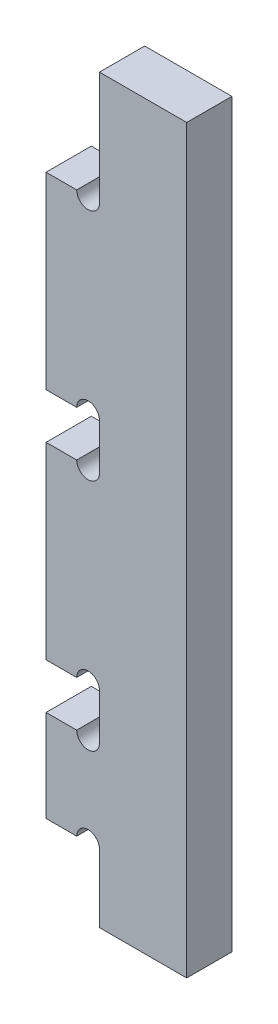
ISO-10303-21;
HEADER;
FILE_DESCRIPTION(('STEP AP214'),'2;1');
FILE_NAME('part.step','',(''),(''),'','','');
FILE_SCHEMA(('AUTOMOTIVE_DESIGN { 1 0 10303 214 1 1 1 1 }'));
ENDSEC;
DATA;
#1=APPLICATION_CONTEXT('core data for automotive mechanical design processes');
#2=APPLICATION_PROTOCOL_DEFINITION('international standard','automotive_design',2000,#1);
#3=PRODUCT_CONTEXT('',#1,'mechanical');
#4=PRODUCT('Part','Part','',(#3));
#5=PRODUCT_RELATED_PRODUCT_CATEGORY('part','',(#4));
#6=PRODUCT_DEFINITION_FORMATION('','',#4);
#7=PRODUCT_DEFINITION_CONTEXT('part definition',#1,'design');
#8=PRODUCT_DEFINITION('design','',#6,#7);
#9=PRODUCT_DEFINITION_SHAPE('','',#8);
#10=(LENGTH_UNIT() NAMED_UNIT(*) SI_UNIT(.MILLI.,.METRE.));
#11=(NAMED_UNIT(*) PLANE_ANGLE_UNIT() SI_UNIT($,.RADIAN.));
#12=(NAMED_UNIT(*) SI_UNIT($,.STERADIAN.) SOLID_ANGLE_UNIT());
#13=UNCERTAINTY_MEASURE_WITH_UNIT(LENGTH_MEASURE(1.E-05),#10,'distance_accuracy_value','');
#14=(GEOMETRIC_REPRESENTATION_CONTEXT(3) GLOBAL_UNCERTAINTY_ASSIGNED_CONTEXT((#13)) GLOBAL_UNIT_ASSIGNED_CONTEXT((#10,
#11,#12)) REPRESENTATION_CONTEXT('',''));
#15=CARTESIAN_POINT('',(0.,0.,0.));
#16=DIRECTION('',(0.,0.,1.));
#17=DIRECTION('',(1.,0.,0.));
#18=AXIS2_PLACEMENT_3D('',#15,#16,#17);
#19=CARTESIAN_POINT('',(210.5,170.,12.7));
#20=DIRECTION('',(1.,0.,0.));
#21=DIRECTION('',(0.,1.,0.));
#22=AXIS2_PLACEMENT_3D('',#19,#20,#21);
#23=PLANE('',#22);
#24=DIRECTION('',(0.,-1.,0.));
#25=VECTOR('',#24,1.);
#26=CARTESIAN_POINT('',(210.5,170.,12.7));
#27=LINE('',#26,#25);
#28=CARTESIAN_POINT('',(210.5,25.8000000000001,12.7));
#29=VERTEX_POINT('',#28);
#30=CARTESIAN_POINT('',(210.5,0.,12.7));
#31=VERTEX_POINT('',#30);
#32=EDGE_CURVE('E311',#29,#31,#27,.T.);
#33=ORIENTED_EDGE('',*,*,#32,.F.);
#34=DIRECTION('',(0.,0.,1.));
#35=VECTOR('',#34,1.);
#36=CARTESIAN_POINT('',(210.5,25.8000000000001,0.));
#37=LINE('',#36,#35);
#38=CARTESIAN_POINT('',(210.5,25.8000000000001,0.));
#39=VERTEX_POINT('',#38);
#40=EDGE_CURVE('E225',#39,#29,#37,.T.);
#41=ORIENTED_EDGE('',*,*,#40,.F.);
#42=DIRECTION('',(0.,-1.,0.));
#43=VECTOR('',#42,1.);
#44=CARTESIAN_POINT('',(210.5,170.,0.));
#45=LINE('',#44,#43);
#46=CARTESIAN_POINT('',(210.5,0.,0.));
#47=VERTEX_POINT('',#46);
#48=EDGE_CURVE('E205',#39,#47,#45,.T.);
#49=ORIENTED_EDGE('',*,*,#48,.T.);
#50=DIRECTION('',(0.,0.,-1.));
#51=VECTOR('',#50,1.);
#52=CARTESIAN_POINT('',(210.5,0.,12.7));
#53=LINE('',#52,#51);
#54=EDGE_CURVE('E315',#31,#47,#53,.T.);
#55=ORIENTED_EDGE('',*,*,#54,.F.);
#56=EDGE_LOOP('',(#33,#41,#49,#55));
#57=FACE_BOUND('',#56,.T.);
#58=ADVANCED_FACE('F35',(#57),#23,.F.);
#59=CARTESIAN_POINT('',(210.5,91.5000000000001,0.));
#60=VERTEX_POINT('',#59);
#61=CARTESIAN_POINT('',(210.5,38.6000000000001,0.));
#62=VERTEX_POINT('',#61);
#63=EDGE_CURVE('E334',#60,#62,#45,.T.);
#64=ORIENTED_EDGE('',*,*,#63,.T.);
#65=DIRECTION('',(0.,0.,1.));
#66=VECTOR('',#65,1.);
#67=CARTESIAN_POINT('',(210.5,38.6000000000001,0.));
#68=LINE('',#67,#66);
#69=CARTESIAN_POINT('',(210.5,38.6000000000001,12.7));
#70=VERTEX_POINT('',#69);
#71=EDGE_CURVE('E228',#62,#70,#68,.T.);
#72=ORIENTED_EDGE('',*,*,#71,.T.);
#73=CARTESIAN_POINT('',(210.5,91.5000000000001,12.7));
#74=VERTEX_POINT('',#73);
#75=EDGE_CURVE('E316',#74,#70,#27,.T.);
#76=ORIENTED_EDGE('',*,*,#75,.F.);
#77=DIRECTION('',(0.,0.,1.));
#78=VECTOR('',#77,1.);
#79=CARTESIAN_POINT('',(210.5,91.5000000000001,0.));
#80=LINE('',#79,#78);
#81=EDGE_CURVE('E263',#60,#74,#80,.T.);
#82=ORIENTED_EDGE('',*,*,#81,.F.);
#83=EDGE_LOOP('',(#64,#72,#76,#82));
#84=FACE_BOUND('',#83,.T.);
#85=ADVANCED_FACE('F381',(#84),#23,.F.);
#86=CARTESIAN_POINT('',(219.1,0.,12.7));
#87=DIRECTION('',(0.,1.,0.));
#88=DIRECTION('',(0.,0.,1.));
#89=AXIS2_PLACEMENT_3D('',#86,#87,#88);
#90=PLANE('',#89);
#91=DIRECTION('',(1.,0.,0.));
#92=VECTOR('',#91,1.);
#93=CARTESIAN_POINT('',(219.1,0.,0.));
#94=LINE('',#93,#92);
#95=CARTESIAN_POINT('',(219.1,0.,0.));
#96=VERTEX_POINT('',#95);
#97=EDGE_CURVE('E290',#47,#96,#94,.T.);
#98=ORIENTED_EDGE('',*,*,#97,.T.);
#99=DIRECTION('',(0.,0.,-1.));
#100=VECTOR('',#99,1.);
#101=CARTESIAN_POINT('',(219.1,0.,12.7));
#102=LINE('',#101,#100);
#103=CARTESIAN_POINT('',(219.1,0.,12.7));
#104=VERTEX_POINT('',#103);
#105=EDGE_CURVE('E11',#104,#96,#102,.T.);
#106=ORIENTED_EDGE('',*,*,#105,.F.);
#107=DIRECTION('',(1.,0.,0.));
#108=VECTOR('',#107,1.);
#109=CARTESIAN_POINT('',(219.1,0.,12.7));
#110=LINE('',#109,#108);
#111=EDGE_CURVE('E295',#31,#104,#110,.T.);
#112=ORIENTED_EDGE('',*,*,#111,.F.);
#113=ORIENTED_EDGE('',*,*,#54,.T.);
#114=EDGE_LOOP('',(#98,#106,#112,#113));
#115=FACE_BOUND('',#114,.T.);
#116=ADVANCED_FACE('F37',(#115),#90,.F.);
#117=CARTESIAN_POINT('',(222.3,0.,12.7));
#118=DIRECTION('',(0.,0.,-1.));
#119=DIRECTION('',(-1.,0.,0.));
#120=AXIS2_PLACEMENT_3D('',#117,#118,#119);
#121=CYLINDRICAL_SURFACE('',#120,3.20000000000001);
#122=CARTESIAN_POINT('',(222.3,0.,0.));
#123=DIRECTION('',(0.,0.,-1.));
#124=DIRECTION('',(1.,0.,0.));
#125=AXIS2_PLACEMENT_3D('',#122,#123,#124);
#126=CIRCLE('',#125,3.20000000000001);
#127=CARTESIAN_POINT('',(225.5,0.,0.));
#128=VERTEX_POINT('',#127);
#129=EDGE_CURVE('E319',#96,#128,#126,.T.);
#130=ORIENTED_EDGE('',*,*,#129,.T.);
#131=DIRECTION('',(0.,0.,-1.));
#132=VECTOR('',#131,1.);
#133=CARTESIAN_POINT('',(225.5,0.,12.7));
#134=LINE('',#133,#132);
#135=CARTESIAN_POINT('',(225.5,0.,12.7));
#136=VERTEX_POINT('',#135);
#137=EDGE_CURVE('E43',#136,#128,#134,.T.);
#138=ORIENTED_EDGE('',*,*,#137,.F.);
#139=CARTESIAN_POINT('',(222.3,0.,12.7));
#140=DIRECTION('',(0.,0.,-1.));
#141=DIRECTION('',(1.,0.,0.));
#142=AXIS2_PLACEMENT_3D('',#139,#140,#141);
#143=CIRCLE('',#142,3.20000000000001);
#144=EDGE_CURVE('E298',#104,#136,#143,.T.);
#145=ORIENTED_EDGE('',*,*,#144,.F.);
#146=ORIENTED_EDGE('',*,*,#105,.T.);
#147=EDGE_LOOP('',(#130,#138,#145,#146));
#148=FACE_BOUND('',#147,.T.);
#149=ADVANCED_FACE('F372',(#148),#121,.F.);
#150=CARTESIAN_POINT('',(225.5,0.,12.7));
#151=DIRECTION('',(1.,0.,0.));
#152=DIRECTION('',(0.,0.,-1.));
#153=AXIS2_PLACEMENT_3D('',#150,#151,#152);
#154=PLANE('',#153);
#155=DIRECTION('',(0.,-1.,0.));
#156=VECTOR('',#155,1.);
#157=CARTESIAN_POINT('',(225.5,0.,0.));
#158=LINE('',#157,#156);
#159=CARTESIAN_POINT('',(225.5,-19.05,0.));
#160=VERTEX_POINT('',#159);
#161=EDGE_CURVE('E321',#128,#160,#158,.T.);
#162=ORIENTED_EDGE('',*,*,#161,.T.);
#163=DIRECTION('',(0.,0.,-1.));
#164=VECTOR('',#163,1.);
#165=CARTESIAN_POINT('',(225.5,-19.05,12.7));
#166=LINE('',#165,#164);
#167=CARTESIAN_POINT('',(225.5,-19.05,12.7));
#168=VERTEX_POINT('',#167);
#169=EDGE_CURVE('E346',#168,#160,#166,.T.);
#170=ORIENTED_EDGE('',*,*,#169,.F.);
#171=DIRECTION('',(0.,-1.,0.));
#172=VECTOR('',#171,1.);
#173=CARTESIAN_POINT('',(225.5,0.,12.7));
#174=LINE('',#173,#172);
#175=EDGE_CURVE('E301',#136,#168,#174,.T.);
#176=ORIENTED_EDGE('',*,*,#175,.F.);
#177=ORIENTED_EDGE('',*,*,#137,.T.);
#178=EDGE_LOOP('',(#162,#170,#176,#177));
#179=FACE_BOUND('',#178,.T.);
#180=ADVANCED_FACE('F353',(#179),#154,.F.);
#181=CARTESIAN_POINT('',(225.5,-19.05,12.7));
#182=DIRECTION('',(0.,1.,0.));
#183=DIRECTION('',(0.,0.,1.));
#184=AXIS2_PLACEMENT_3D('',#181,#182,#183);
#185=PLANE('',#184);
#186=DIRECTION('',(1.,0.,0.));
#187=VECTOR('',#186,1.);
#188=CARTESIAN_POINT('',(225.5,-19.05,0.));
#189=LINE('',#188,#187);
#190=CARTESIAN_POINT('',(250.,-19.05,0.));
#191=VERTEX_POINT('',#190);
#192=EDGE_CURVE('E323',#160,#191,#189,.T.);
#193=ORIENTED_EDGE('',*,*,#192,.T.);
#194=DIRECTION('',(0.,0.,-1.));
#195=VECTOR('',#194,1.);
#196=CARTESIAN_POINT('',(250.,-19.05,12.7));
#197=LINE('',#196,#195);
#198=CARTESIAN_POINT('',(250.,-19.05,12.7));
#199=VERTEX_POINT('',#198);
#200=EDGE_CURVE('E343',#199,#191,#197,.T.);
#201=ORIENTED_EDGE('',*,*,#200,.F.);
#202=DIRECTION('',(1.,0.,0.));
#203=VECTOR('',#202,1.);
#204=CARTESIAN_POINT('',(225.5,-19.05,12.7));
#205=LINE('',#204,#203);
#206=EDGE_CURVE('E303',#168,#199,#205,.T.);
#207=ORIENTED_EDGE('',*,*,#206,.F.);
#208=ORIENTED_EDGE('',*,*,#169,.T.);
#209=EDGE_LOOP('',(#193,#201,#207,#208));
#210=FACE_BOUND('',#209,.T.);
#211=ADVANCED_FACE('F360',(#210),#185,.F.);
#212=CARTESIAN_POINT('',(250.,189.05,12.7));
#213=DIRECTION('',(-1.,0.,0.));
#214=DIRECTION('',(0.,0.,1.));
#215=AXIS2_PLACEMENT_3D('',#212,#213,#214);
#216=PLANE('',#215);
#217=DIRECTION('',(0.,1.,0.));
#218=VECTOR('',#217,1.);
#219=CARTESIAN_POINT('',(250.,189.05,0.));
#220=LINE('',#219,#218);
#221=CARTESIAN_POINT('',(250.,189.05,0.));
#222=VERTEX_POINT('',#221);
#223=EDGE_CURVE('E326',#191,#222,#220,.T.);
#224=ORIENTED_EDGE('',*,*,#223,.T.);
#225=DIRECTION('',(0.,0.,-1.));
#226=VECTOR('',#225,1.);
#227=CARTESIAN_POINT('',(250.,189.05,12.7));
#228=LINE('',#227,#226);
#229=CARTESIAN_POINT('',(250.,189.05,12.7));
#230=VERTEX_POINT('',#229);
#231=EDGE_CURVE('E340',#230,#222,#228,.T.);
#232=ORIENTED_EDGE('',*,*,#231,.F.);
#233=DIRECTION('',(0.,1.,0.));
#234=VECTOR('',#233,1.);
#235=CARTESIAN_POINT('',(250.,-19.05,12.7));
#236=LINE('',#235,#234);
#237=EDGE_CURVE('E305',#199,#230,#236,.T.);
#238=ORIENTED_EDGE('',*,*,#237,.F.);
#239=ORIENTED_EDGE('',*,*,#200,.T.);
#240=EDGE_LOOP('',(#224,#232,#238,#239));
#241=FACE_BOUND('',#240,.T.);
#242=ADVANCED_FACE('F364',(#241),#216,.F.);
#243=CARTESIAN_POINT('',(225.5,189.05,12.7));
#244=DIRECTION('',(0.,-1.,0.));
#245=DIRECTION('',(0.,0.,-1.));
#246=AXIS2_PLACEMENT_3D('',#243,#244,#245);
#247=PLANE('',#246);
#248=DIRECTION('',(-1.,0.,0.));
#249=VECTOR('',#248,1.);
#250=CARTESIAN_POINT('',(225.5,189.05,0.));
#251=LINE('',#250,#249);
#252=CARTESIAN_POINT('',(225.5,189.05,0.));
#253=VERTEX_POINT('',#252);
#254=EDGE_CURVE('E328',#222,#253,#251,.T.);
#255=ORIENTED_EDGE('',*,*,#254,.T.);
#256=DIRECTION('',(0.,0.,-1.));
#257=VECTOR('',#256,1.);
#258=CARTESIAN_POINT('',(225.5,189.05,12.7));
#259=LINE('',#258,#257);
#260=CARTESIAN_POINT('',(225.5,189.05,12.7));
#261=VERTEX_POINT('',#260);
#262=EDGE_CURVE('E337',#261,#253,#259,.T.);
#263=ORIENTED_EDGE('',*,*,#262,.F.);
#264=DIRECTION('',(-1.,0.,0.));
#265=VECTOR('',#264,1.);
#266=CARTESIAN_POINT('',(225.5,189.05,12.7));
#267=LINE('',#266,#265);
#268=EDGE_CURVE('E307',#230,#261,#267,.T.);
#269=ORIENTED_EDGE('',*,*,#268,.F.);
#270=ORIENTED_EDGE('',*,*,#231,.T.);
#271=EDGE_LOOP('',(#255,#263,#269,#270));
#272=FACE_BOUND('',#271,.T.);
#273=ADVANCED_FACE('F420',(#272),#247,.F.);
#274=CARTESIAN_POINT('',(225.5,170.,12.7));
#275=DIRECTION('',(1.,0.,0.));
#276=DIRECTION('',(0.,1.,0.));
#277=AXIS2_PLACEMENT_3D('',#274,#275,#276);
#278=PLANE('',#277);
#279=DIRECTION('',(0.,-1.,0.));
#280=VECTOR('',#279,1.);
#281=CARTESIAN_POINT('',(225.5,170.,0.));
#282=LINE('',#281,#280);
#283=CARTESIAN_POINT('',(225.5,157.2,0.));
#284=VERTEX_POINT('',#283);
#285=EDGE_CURVE('E330',#253,#284,#282,.T.);
#286=ORIENTED_EDGE('',*,*,#285,.T.);
#287=DIRECTION('',(0.,0.,1.));
#288=VECTOR('',#287,1.);
#289=CARTESIAN_POINT('',(225.5,157.2,0.));
#290=LINE('',#289,#288);
#291=CARTESIAN_POINT('',(225.5,157.2,12.7));
#292=VERTEX_POINT('',#291);
#293=EDGE_CURVE('E291',#284,#292,#290,.T.);
#294=ORIENTED_EDGE('',*,*,#293,.T.);
#295=DIRECTION('',(0.,-1.,0.));
#296=VECTOR('',#295,1.);
#297=CARTESIAN_POINT('',(225.5,170.,12.7));
#298=LINE('',#297,#296);
#299=EDGE_CURVE('E309',#261,#292,#298,.T.);
#300=ORIENTED_EDGE('',*,*,#299,.F.);
#301=ORIENTED_EDGE('',*,*,#262,.T.);
#302=EDGE_LOOP('',(#286,#294,#300,#301));
#303=FACE_BOUND('',#302,.T.);
#304=ADVANCED_FACE('F413',(#303),#278,.F.);
#305=CARTESIAN_POINT('',(210.5,157.2,0.));
#306=VERTEX_POINT('',#305);
#307=CARTESIAN_POINT('',(210.5,104.3,0.));
#308=VERTEX_POINT('',#307);
#309=EDGE_CURVE('E299',#306,#308,#45,.T.);
#310=ORIENTED_EDGE('',*,*,#309,.T.);
#311=DIRECTION('',(0.,0.,1.));
#312=VECTOR('',#311,1.);
#313=CARTESIAN_POINT('',(210.5,104.3,0.));
#314=LINE('',#313,#312);
#315=CARTESIAN_POINT('',(210.5,104.3,12.7));
#316=VERTEX_POINT('',#315);
#317=EDGE_CURVE('E266',#308,#316,#314,.T.);
#318=ORIENTED_EDGE('',*,*,#317,.T.);
#319=CARTESIAN_POINT('',(210.5,157.2,12.7));
#320=VERTEX_POINT('',#319);
#321=EDGE_CURVE('E312',#320,#316,#27,.T.);
#322=ORIENTED_EDGE('',*,*,#321,.F.);
#323=DIRECTION('',(0.,0.,1.));
#324=VECTOR('',#323,1.);
#325=CARTESIAN_POINT('',(210.5,157.2,0.));
#326=LINE('',#325,#324);
#327=EDGE_CURVE('E288',#306,#320,#326,.T.);
#328=ORIENTED_EDGE('',*,*,#327,.F.);
#329=EDGE_LOOP('',(#310,#318,#322,#328));
#330=FACE_BOUND('',#329,.T.);
#331=ADVANCED_FACE('F406',(#330),#23,.F.);
#332=CARTESIAN_POINT('',(222.3,170.,12.7));
#333=DIRECTION('',(0.,0.,1.));
#334=DIRECTION('',(1.,0.,0.));
#335=AXIS2_PLACEMENT_3D('',#332,#333,#334);
#336=PLANE('',#335);
#337=DIRECTION('',(1.,0.,0.));
#338=VECTOR('',#337,1.);
#339=CARTESIAN_POINT('',(210.5,25.8000000000001,12.7));
#340=LINE('',#339,#338);
#341=CARTESIAN_POINT('',(219.1,25.8000000000001,12.7));
#342=VERTEX_POINT('',#341);
#343=EDGE_CURVE('E190',#29,#342,#340,.T.);
#344=ORIENTED_EDGE('',*,*,#343,.F.);
#345=ORIENTED_EDGE('',*,*,#32,.T.);
#346=ORIENTED_EDGE('',*,*,#111,.T.);
#347=ORIENTED_EDGE('',*,*,#144,.T.);
#348=ORIENTED_EDGE('',*,*,#175,.T.);
#349=ORIENTED_EDGE('',*,*,#206,.T.);
#350=ORIENTED_EDGE('',*,*,#237,.T.);
#351=ORIENTED_EDGE('',*,*,#268,.T.);
#352=ORIENTED_EDGE('',*,*,#299,.T.);
#353=CARTESIAN_POINT('',(222.3,157.2,12.7));
#354=DIRECTION('',(0.,0.,1.));
#355=DIRECTION('',(1.,0.,0.));
#356=AXIS2_PLACEMENT_3D('',#353,#354,#355);
#357=CIRCLE('',#356,3.20000000000001);
#358=CARTESIAN_POINT('',(219.1,157.2,12.7));
#359=VERTEX_POINT('',#358);
#360=EDGE_CURVE('E280',#359,#292,#357,.T.);
#361=ORIENTED_EDGE('',*,*,#360,.F.);
#362=DIRECTION('',(1.,0.,0.));
#363=VECTOR('',#362,1.);
#364=CARTESIAN_POINT('',(210.5,157.2,12.7));
#365=LINE('',#364,#363);
#366=EDGE_CURVE('E265',#320,#359,#365,.T.);
#367=ORIENTED_EDGE('',*,*,#366,.F.);
#368=ORIENTED_EDGE('',*,*,#321,.T.);
#369=DIRECTION('',(-1.,0.,0.));
#370=VECTOR('',#369,1.);
#371=CARTESIAN_POINT('',(210.5,104.3,12.7));
#372=LINE('',#371,#370);
#373=CARTESIAN_POINT('',(219.1,104.3,12.7));
#374=VERTEX_POINT('',#373);
#375=EDGE_CURVE('E240',#374,#316,#372,.T.);
#376=ORIENTED_EDGE('',*,*,#375,.F.);
#377=CARTESIAN_POINT('',(222.3,104.3,12.7));
#378=DIRECTION('',(0.,0.,1.));
#379=DIRECTION('',(1.,0.,0.));
#380=AXIS2_PLACEMENT_3D('',#377,#378,#379);
#381=CIRCLE('',#380,3.20000000000001);
#382=CARTESIAN_POINT('',(225.5,104.3,12.7));
#383=VERTEX_POINT('',#382);
#384=EDGE_CURVE('E259',#383,#374,#381,.T.);
#385=ORIENTED_EDGE('',*,*,#384,.F.);
#386=DIRECTION('',(0.,1.,0.));
#387=VECTOR('',#386,1.);
#388=CARTESIAN_POINT('',(225.5,91.5000000000001,12.7));
#389=LINE('',#388,#387);
#390=CARTESIAN_POINT('',(225.5,91.5000000000001,12.7));
#391=VERTEX_POINT('',#390);
#392=EDGE_CURVE('E256',#391,#383,#389,.T.);
#393=ORIENTED_EDGE('',*,*,#392,.F.);
#394=CARTESIAN_POINT('',(222.3,91.5000000000001,12.7));
#395=DIRECTION('',(0.,0.,1.));
#396=DIRECTION('',(1.,0.,0.));
#397=AXIS2_PLACEMENT_3D('',#394,#395,#396);
#398=CIRCLE('',#397,3.20000000000001);
#399=CARTESIAN_POINT('',(219.1,91.5000000000001,12.7));
#400=VERTEX_POINT('',#399);
#401=EDGE_CURVE('E253',#400,#391,#398,.T.);
#402=ORIENTED_EDGE('',*,*,#401,.F.);
#403=DIRECTION('',(1.,0.,0.));
#404=VECTOR('',#403,1.);
#405=CARTESIAN_POINT('',(210.5,91.5000000000001,12.7));
#406=LINE('',#405,#404);
#407=EDGE_CURVE('E227',#74,#400,#406,.T.);
#408=ORIENTED_EDGE('',*,*,#407,.F.);
#409=ORIENTED_EDGE('',*,*,#75,.T.);
#410=DIRECTION('',(-1.,0.,0.));
#411=VECTOR('',#410,1.);
#412=CARTESIAN_POINT('',(210.5,38.6000000000001,12.7));
#413=LINE('',#412,#411);
#414=CARTESIAN_POINT('',(219.1,38.6,12.7));
#415=VERTEX_POINT('',#414);
#416=EDGE_CURVE('E206',#415,#70,#413,.T.);
#417=ORIENTED_EDGE('',*,*,#416,.F.);
#418=CARTESIAN_POINT('',(222.3,38.6,12.7));
#419=DIRECTION('',(0.,0.,1.));
#420=DIRECTION('',(1.,0.,0.));
#421=AXIS2_PLACEMENT_3D('',#418,#419,#420);
#422=CIRCLE('',#421,3.20000000000001);
#423=CARTESIAN_POINT('',(225.5,38.6000000000001,12.7));
#424=VERTEX_POINT('',#423);
#425=EDGE_CURVE('E208',#424,#415,#422,.T.);
#426=ORIENTED_EDGE('',*,*,#425,.F.);
#427=DIRECTION('',(0.,1.,0.));
#428=VECTOR('',#427,1.);
#429=CARTESIAN_POINT('',(225.5,25.8000000000001,12.7));
#430=LINE('',#429,#428);
#431=CARTESIAN_POINT('',(225.5,25.8000000000001,12.7));
#432=VERTEX_POINT('',#431);
#433=EDGE_CURVE('E220',#432,#424,#430,.T.);
#434=ORIENTED_EDGE('',*,*,#433,.F.);
#435=CARTESIAN_POINT('',(222.3,25.8000000000001,12.7));
#436=DIRECTION('',(0.,0.,1.));
#437=DIRECTION('',(1.,0.,0.));
#438=AXIS2_PLACEMENT_3D('',#435,#436,#437);
#439=CIRCLE('',#438,3.20000000000001);
#440=EDGE_CURVE('E218',#342,#432,#439,.T.);
#441=ORIENTED_EDGE('',*,*,#440,.F.);
#442=EDGE_LOOP('',(#344,#345,#346,#347,#348,#349,#350,#351,#352,#361,#367,#368,#376,#385,#393,
#402,#408,#409,#417,#426,#434,#441));
#443=FACE_BOUND('',#442,.T.);
#444=ADVANCED_FACE('F368',(#443),#336,.T.);
#445=CARTESIAN_POINT('',(222.3,170.,0.));
#446=DIRECTION('',(0.,0.,1.));
#447=DIRECTION('',(1.,0.,0.));
#448=AXIS2_PLACEMENT_3D('',#445,#446,#447);
#449=PLANE('',#448);
#450=ORIENTED_EDGE('',*,*,#48,.F.);
#451=DIRECTION('',(1.,0.,0.));
#452=VECTOR('',#451,1.);
#453=CARTESIAN_POINT('',(210.5,25.8000000000001,0.));
#454=LINE('',#453,#452);
#455=CARTESIAN_POINT('',(219.1,25.8000000000001,0.));
#456=VERTEX_POINT('',#455);
#457=EDGE_CURVE('E187',#39,#456,#454,.T.);
#458=ORIENTED_EDGE('',*,*,#457,.T.);
#459=CARTESIAN_POINT('',(222.3,25.8000000000001,0.));
#460=DIRECTION('',(0.,0.,1.));
#461=DIRECTION('',(1.,0.,0.));
#462=AXIS2_PLACEMENT_3D('',#459,#460,#461);
#463=CIRCLE('',#462,3.20000000000001);
#464=CARTESIAN_POINT('',(225.5,25.8000000000001,0.));
#465=VERTEX_POINT('',#464);
#466=EDGE_CURVE('E198',#456,#465,#463,.T.);
#467=ORIENTED_EDGE('',*,*,#466,.T.);
#468=DIRECTION('',(0.,1.,0.));
#469=VECTOR('',#468,1.);
#470=CARTESIAN_POINT('',(225.5,25.8000000000001,0.));
#471=LINE('',#470,#469);
#472=CARTESIAN_POINT('',(225.5,38.6000000000001,0.));
#473=VERTEX_POINT('',#472);
#474=EDGE_CURVE('E50',#465,#473,#471,.T.);
#475=ORIENTED_EDGE('',*,*,#474,.T.);
#476=CARTESIAN_POINT('',(222.3,38.6,0.));
#477=DIRECTION('',(0.,0.,1.));
#478=DIRECTION('',(1.,0.,0.));
#479=AXIS2_PLACEMENT_3D('',#476,#477,#478);
#480=CIRCLE('',#479,3.20000000000001);
#481=CARTESIAN_POINT('',(219.1,38.6,0.));
#482=VERTEX_POINT('',#481);
#483=EDGE_CURVE('E212',#473,#482,#480,.T.);
#484=ORIENTED_EDGE('',*,*,#483,.T.);
#485=DIRECTION('',(-1.,0.,0.));
#486=VECTOR('',#485,1.);
#487=CARTESIAN_POINT('',(210.5,38.6000000000001,0.));
#488=LINE('',#487,#486);
#489=EDGE_CURVE('E195',#482,#62,#488,.T.);
#490=ORIENTED_EDGE('',*,*,#489,.T.);
#491=ORIENTED_EDGE('',*,*,#63,.F.);
#492=DIRECTION('',(1.,0.,0.));
#493=VECTOR('',#492,1.);
#494=CARTESIAN_POINT('',(210.5,91.5000000000001,0.));
#495=LINE('',#494,#493);
#496=CARTESIAN_POINT('',(219.1,91.5000000000001,0.));
#497=VERTEX_POINT('',#496);
#498=EDGE_CURVE('E236',#60,#497,#495,.T.);
#499=ORIENTED_EDGE('',*,*,#498,.T.);
#500=CARTESIAN_POINT('',(222.3,91.5000000000001,0.));
#501=DIRECTION('',(0.,0.,1.));
#502=DIRECTION('',(1.,0.,0.));
#503=AXIS2_PLACEMENT_3D('',#500,#501,#502);
#504=CIRCLE('',#503,3.20000000000001);
#505=CARTESIAN_POINT('',(225.5,91.5000000000001,0.));
#506=VERTEX_POINT('',#505);
#507=EDGE_CURVE('E239',#497,#506,#504,.T.);
#508=ORIENTED_EDGE('',*,*,#507,.T.);
#509=DIRECTION('',(0.,1.,0.));
#510=VECTOR('',#509,1.);
#511=CARTESIAN_POINT('',(225.5,91.5000000000001,0.));
#512=LINE('',#511,#510);
#513=CARTESIAN_POINT('',(225.5,104.3,0.));
#514=VERTEX_POINT('',#513);
#515=EDGE_CURVE('E58',#506,#514,#512,.T.);
#516=ORIENTED_EDGE('',*,*,#515,.T.);
#517=CARTESIAN_POINT('',(222.3,104.3,0.));
#518=DIRECTION('',(0.,0.,1.));
#519=DIRECTION('',(1.,0.,0.));
#520=AXIS2_PLACEMENT_3D('',#517,#518,#519);
#521=CIRCLE('',#520,3.20000000000001);
#522=CARTESIAN_POINT('',(219.1,104.3,0.));
#523=VERTEX_POINT('',#522);
#524=EDGE_CURVE('E244',#514,#523,#521,.T.);
#525=ORIENTED_EDGE('',*,*,#524,.T.);
#526=DIRECTION('',(-1.,0.,0.));
#527=VECTOR('',#526,1.);
#528=CARTESIAN_POINT('',(210.5,104.3,0.));
#529=LINE('',#528,#527);
#530=EDGE_CURVE('E247',#523,#308,#529,.T.);
#531=ORIENTED_EDGE('',*,*,#530,.T.);
#532=ORIENTED_EDGE('',*,*,#309,.F.);
#533=DIRECTION('',(1.,0.,0.));
#534=VECTOR('',#533,1.);
#535=CARTESIAN_POINT('',(210.5,157.2,0.));
#536=LINE('',#535,#534);
#537=CARTESIAN_POINT('',(219.1,157.2,0.));
#538=VERTEX_POINT('',#537);
#539=EDGE_CURVE('E276',#306,#538,#536,.T.);
#540=ORIENTED_EDGE('',*,*,#539,.T.);
#541=CARTESIAN_POINT('',(222.3,157.2,0.));
#542=DIRECTION('',(0.,0.,1.));
#543=DIRECTION('',(1.,0.,0.));
#544=AXIS2_PLACEMENT_3D('',#541,#542,#543);
#545=CIRCLE('',#544,3.20000000000001);
#546=EDGE_CURVE('E279',#538,#284,#545,.T.);
#547=ORIENTED_EDGE('',*,*,#546,.T.);
#548=ORIENTED_EDGE('',*,*,#285,.F.);
#549=ORIENTED_EDGE('',*,*,#254,.F.);
#550=ORIENTED_EDGE('',*,*,#223,.F.);
#551=ORIENTED_EDGE('',*,*,#192,.F.);
#552=ORIENTED_EDGE('',*,*,#161,.F.);
#553=ORIENTED_EDGE('',*,*,#129,.F.);
#554=ORIENTED_EDGE('',*,*,#97,.F.);
#555=EDGE_LOOP('',(#450,#458,#467,#475,#484,#490,#491,#499,#508,#516,#525,#531,#532,#540,#547,
#548,#549,#550,#551,#552,#553,#554));
#556=FACE_BOUND('',#555,.T.);
#557=ADVANCED_FACE('F203',(#556),#449,.F.);
#558=CARTESIAN_POINT('',(210.5,157.2,0.));
#559=DIRECTION('',(0.,-1.,0.));
#560=DIRECTION('',(1.,0.,0.));
#561=AXIS2_PLACEMENT_3D('',#558,#559,#560);
#562=PLANE('',#561);
#563=ORIENTED_EDGE('',*,*,#366,.T.);
#564=DIRECTION('',(0.,0.,1.));
#565=VECTOR('',#564,1.);
#566=CARTESIAN_POINT('',(219.1,157.2,0.));
#567=LINE('',#566,#565);
#568=EDGE_CURVE('E283',#538,#359,#567,.T.);
#569=ORIENTED_EDGE('',*,*,#568,.F.);
#570=ORIENTED_EDGE('',*,*,#539,.F.);
#571=ORIENTED_EDGE('',*,*,#327,.T.);
#572=EDGE_LOOP('',(#563,#569,#570,#571));
#573=FACE_BOUND('',#572,.T.);
#574=ADVANCED_FACE('F435',(#573),#562,.F.);
#575=CARTESIAN_POINT('',(222.3,157.2,0.));
#576=DIRECTION('',(0.,0.,1.));
#577=DIRECTION('',(1.,0.,0.));
#578=AXIS2_PLACEMENT_3D('',#575,#576,#577);
#579=CYLINDRICAL_SURFACE('',#578,3.20000000000001);
#580=ORIENTED_EDGE('',*,*,#360,.T.);
#581=ORIENTED_EDGE('',*,*,#293,.F.);
#582=ORIENTED_EDGE('',*,*,#546,.F.);
#583=ORIENTED_EDGE('',*,*,#568,.T.);
#584=EDGE_LOOP('',(#580,#581,#582,#583));
#585=FACE_BOUND('',#584,.T.);
#586=ADVANCED_FACE('F439',(#585),#579,.F.);
#587=CARTESIAN_POINT('',(210.5,91.5000000000001,0.));
#588=DIRECTION('',(0.,-1.,0.));
#589=DIRECTION('',(1.,0.,0.));
#590=AXIS2_PLACEMENT_3D('',#587,#588,#589);
#591=PLANE('',#590);
#592=ORIENTED_EDGE('',*,*,#407,.T.);
#593=DIRECTION('',(0.,0.,1.));
#594=VECTOR('',#593,1.);
#595=CARTESIAN_POINT('',(219.1,91.5000000000001,0.));
#596=LINE('',#595,#594);
#597=EDGE_CURVE('E250',#497,#400,#596,.T.);
#598=ORIENTED_EDGE('',*,*,#597,.F.);
#599=ORIENTED_EDGE('',*,*,#498,.F.);
#600=ORIENTED_EDGE('',*,*,#81,.T.);
#601=EDGE_LOOP('',(#592,#598,#599,#600));
#602=FACE_BOUND('',#601,.T.);
#603=ADVANCED_FACE('F492',(#602),#591,.F.);
#604=CARTESIAN_POINT('',(210.5,104.3,0.));
#605=DIRECTION('',(0.,1.,0.));
#606=DIRECTION('',(-1.,0.,0.));
#607=AXIS2_PLACEMENT_3D('',#604,#605,#606);
#608=PLANE('',#607);
#609=ORIENTED_EDGE('',*,*,#375,.T.);
#610=ORIENTED_EDGE('',*,*,#317,.F.);
#611=ORIENTED_EDGE('',*,*,#530,.F.);
#612=DIRECTION('',(0.,0.,1.));
#613=VECTOR('',#612,1.);
#614=CARTESIAN_POINT('',(219.1,104.3,0.));
#615=LINE('',#614,#613);
#616=EDGE_CURVE('E269',#523,#374,#615,.T.);
#617=ORIENTED_EDGE('',*,*,#616,.T.);
#618=EDGE_LOOP('',(#609,#610,#611,#617));
#619=FACE_BOUND('',#618,.T.);
#620=ADVANCED_FACE('F428',(#619),#608,.F.);
#621=CARTESIAN_POINT('',(222.3,104.3,0.));
#622=DIRECTION('',(0.,0.,1.));
#623=DIRECTION('',(1.,0.,0.));
#624=AXIS2_PLACEMENT_3D('',#621,#622,#623);
#625=CYLINDRICAL_SURFACE('',#624,3.20000000000001);
#626=ORIENTED_EDGE('',*,*,#384,.T.);
#627=ORIENTED_EDGE('',*,*,#616,.F.);
#628=ORIENTED_EDGE('',*,*,#524,.F.);
#629=DIRECTION('',(0.,0.,1.));
#630=VECTOR('',#629,1.);
#631=CARTESIAN_POINT('',(225.5,104.3,0.));
#632=LINE('',#631,#630);
#633=EDGE_CURVE('E271',#514,#383,#632,.T.);
#634=ORIENTED_EDGE('',*,*,#633,.T.);
#635=EDGE_LOOP('',(#626,#627,#628,#634));
#636=FACE_BOUND('',#635,.T.);
#637=ADVANCED_FACE('F507',(#636),#625,.F.);
#638=CARTESIAN_POINT('',(225.5,91.5000000000001,0.));
#639=DIRECTION('',(1.,0.,0.));
#640=DIRECTION('',(0.,0.,-1.));
#641=AXIS2_PLACEMENT_3D('',#638,#639,#640);
#642=PLANE('',#641);
#643=ORIENTED_EDGE('',*,*,#392,.T.);
#644=ORIENTED_EDGE('',*,*,#633,.F.);
#645=ORIENTED_EDGE('',*,*,#515,.F.);
#646=DIRECTION('',(0.,0.,1.));
#647=VECTOR('',#646,1.);
#648=CARTESIAN_POINT('',(225.5,91.5000000000001,0.));
#649=LINE('',#648,#647);
#650=EDGE_CURVE('E273',#506,#391,#649,.T.);
#651=ORIENTED_EDGE('',*,*,#650,.T.);
#652=EDGE_LOOP('',(#643,#644,#645,#651));
#653=FACE_BOUND('',#652,.T.);
#654=ADVANCED_FACE('F516',(#653),#642,.F.);
#655=CARTESIAN_POINT('',(222.3,91.5000000000001,0.));
#656=DIRECTION('',(0.,0.,1.));
#657=DIRECTION('',(1.,0.,0.));
#658=AXIS2_PLACEMENT_3D('',#655,#656,#657);
#659=CYLINDRICAL_SURFACE('',#658,3.20000000000001);
#660=ORIENTED_EDGE('',*,*,#401,.T.);
#661=ORIENTED_EDGE('',*,*,#650,.F.);
#662=ORIENTED_EDGE('',*,*,#507,.F.);
#663=ORIENTED_EDGE('',*,*,#597,.T.);
#664=EDGE_LOOP('',(#660,#661,#662,#663));
#665=FACE_BOUND('',#664,.T.);
#666=ADVANCED_FACE('F526',(#665),#659,.F.);
#667=CARTESIAN_POINT('',(210.5,25.8000000000001,0.));
#668=DIRECTION('',(0.,-1.,0.));
#669=DIRECTION('',(1.,0.,0.));
#670=AXIS2_PLACEMENT_3D('',#667,#668,#669);
#671=PLANE('',#670);
#672=ORIENTED_EDGE('',*,*,#343,.T.);
#673=DIRECTION('',(0.,0.,1.));
#674=VECTOR('',#673,1.);
#675=CARTESIAN_POINT('',(219.1,25.8000000000001,0.));
#676=LINE('',#675,#674);
#677=EDGE_CURVE('E183',#456,#342,#676,.T.);
#678=ORIENTED_EDGE('',*,*,#677,.F.);
#679=ORIENTED_EDGE('',*,*,#457,.F.);
#680=ORIENTED_EDGE('',*,*,#40,.T.);
#681=EDGE_LOOP('',(#672,#678,#679,#680));
#682=FACE_BOUND('',#681,.T.);
#683=ADVANCED_FACE('F185',(#682),#671,.F.);
#684=CARTESIAN_POINT('',(210.5,38.6000000000001,0.));
#685=DIRECTION('',(0.,1.,0.));
#686=DIRECTION('',(-1.,0.,0.));
#687=AXIS2_PLACEMENT_3D('',#684,#685,#686);
#688=PLANE('',#687);
#689=ORIENTED_EDGE('',*,*,#416,.T.);
#690=ORIENTED_EDGE('',*,*,#71,.F.);
#691=ORIENTED_EDGE('',*,*,#489,.F.);
#692=DIRECTION('',(0.,0.,1.));
#693=VECTOR('',#692,1.);
#694=CARTESIAN_POINT('',(219.1,38.6,0.));
#695=LINE('',#694,#693);
#696=EDGE_CURVE('E231',#482,#415,#695,.T.);
#697=ORIENTED_EDGE('',*,*,#696,.T.);
#698=EDGE_LOOP('',(#689,#690,#691,#697));
#699=FACE_BOUND('',#698,.T.);
#700=ADVANCED_FACE('F387',(#699),#688,.F.);
#701=CARTESIAN_POINT('',(222.3,38.6,0.));
#702=DIRECTION('',(0.,0.,1.));
#703=DIRECTION('',(1.,0.,0.));
#704=AXIS2_PLACEMENT_3D('',#701,#702,#703);
#705=CYLINDRICAL_SURFACE('',#704,3.20000000000001);
#706=ORIENTED_EDGE('',*,*,#425,.T.);
#707=ORIENTED_EDGE('',*,*,#696,.F.);
#708=ORIENTED_EDGE('',*,*,#483,.F.);
#709=DIRECTION('',(0.,0.,1.));
#710=VECTOR('',#709,1.);
#711=CARTESIAN_POINT('',(225.5,38.6000000000001,0.));
#712=LINE('',#711,#710);
#713=EDGE_CURVE('E233',#473,#424,#712,.T.);
#714=ORIENTED_EDGE('',*,*,#713,.T.);
#715=EDGE_LOOP('',(#706,#707,#708,#714));
#716=FACE_BOUND('',#715,.T.);
#717=ADVANCED_FACE('F395',(#716),#705,.F.);
#718=CARTESIAN_POINT('',(225.5,25.8000000000001,0.));
#719=DIRECTION('',(1.,0.,0.));
#720=DIRECTION('',(0.,0.,-1.));
#721=AXIS2_PLACEMENT_3D('',#718,#719,#720);
#722=PLANE('',#721);
#723=ORIENTED_EDGE('',*,*,#433,.T.);
#724=ORIENTED_EDGE('',*,*,#713,.F.);
#725=ORIENTED_EDGE('',*,*,#474,.F.);
#726=DIRECTION('',(0.,0.,1.));
#727=VECTOR('',#726,1.);
#728=CARTESIAN_POINT('',(225.5,25.8000000000001,0.));
#729=LINE('',#728,#727);
#730=EDGE_CURVE('E194',#465,#432,#729,.T.);
#731=ORIENTED_EDGE('',*,*,#730,.T.);
#732=EDGE_LOOP('',(#723,#724,#725,#731));
#733=FACE_BOUND('',#732,.T.);
#734=ADVANCED_FACE('F393',(#733),#722,.F.);
#735=CARTESIAN_POINT('',(222.3,25.8000000000001,0.));
#736=DIRECTION('',(0.,0.,1.));
#737=DIRECTION('',(1.,0.,0.));
#738=AXIS2_PLACEMENT_3D('',#735,#736,#737);
#739=CYLINDRICAL_SURFACE('',#738,3.20000000000001);
#740=ORIENTED_EDGE('',*,*,#440,.T.);
#741=ORIENTED_EDGE('',*,*,#730,.F.);
#742=ORIENTED_EDGE('',*,*,#466,.F.);
#743=ORIENTED_EDGE('',*,*,#677,.T.);
#744=EDGE_LOOP('',(#740,#741,#742,#743));
#745=FACE_BOUND('',#744,.T.);
#746=ADVANCED_FACE('F199',(#745),#739,.F.);
#747=CLOSED_SHELL('',(#58,#85,#116,#149,#180,#211,#242,#273,#304,#331,#444,#557,#574,#586,#603,
#620,#637,#654,#666,#683,#700,#717,#734,#746));
#748=MANIFOLD_SOLID_BREP('B2',#747);
#749=ADVANCED_BREP_SHAPE_REPRESENTATION('',(#18,#748),#14);
#750=SHAPE_DEFINITION_REPRESENTATION(#9,#749);
ENDSEC;
END-ISO-10303-21;
